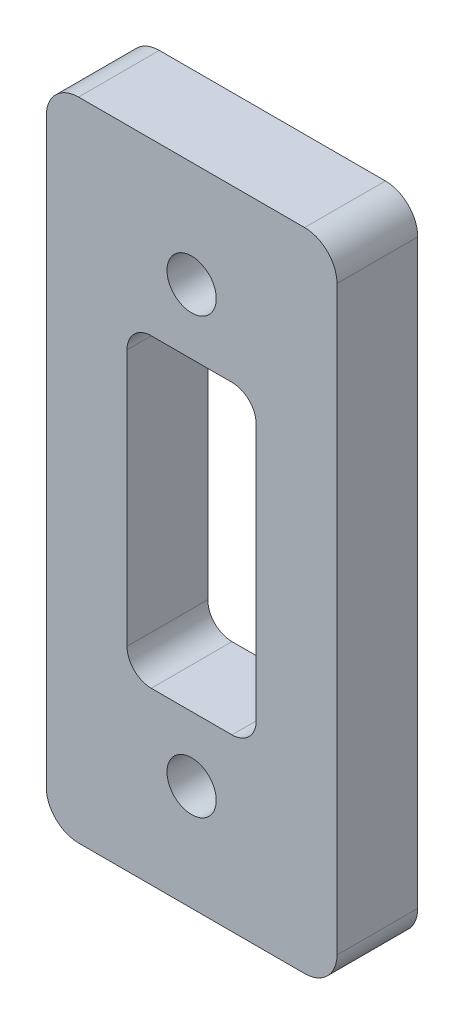
ISO-10303-21;
HEADER;
FILE_DESCRIPTION(('STEP AP214'),'2;1');
FILE_NAME('part.step','',(''),(''),'','','');
FILE_SCHEMA(('AUTOMOTIVE_DESIGN { 1 0 10303 214 1 1 1 1 }'));
ENDSEC;
DATA;
#1=APPLICATION_CONTEXT('core data for automotive mechanical design processes');
#2=APPLICATION_PROTOCOL_DEFINITION('international standard','automotive_design',2000,#1);
#3=PRODUCT_CONTEXT('',#1,'mechanical');
#4=PRODUCT('Part','Part','',(#3));
#5=PRODUCT_RELATED_PRODUCT_CATEGORY('part','',(#4));
#6=PRODUCT_DEFINITION_FORMATION('','',#4);
#7=PRODUCT_DEFINITION_CONTEXT('part definition',#1,'design');
#8=PRODUCT_DEFINITION('design','',#6,#7);
#9=PRODUCT_DEFINITION_SHAPE('','',#8);
#10=(LENGTH_UNIT() NAMED_UNIT(*) SI_UNIT(.MILLI.,.METRE.));
#11=(NAMED_UNIT(*) PLANE_ANGLE_UNIT() SI_UNIT($,.RADIAN.));
#12=(NAMED_UNIT(*) SI_UNIT($,.STERADIAN.) SOLID_ANGLE_UNIT());
#13=UNCERTAINTY_MEASURE_WITH_UNIT(LENGTH_MEASURE(1.E-05),#10,'distance_accuracy_value','');
#14=(GEOMETRIC_REPRESENTATION_CONTEXT(3) GLOBAL_UNCERTAINTY_ASSIGNED_CONTEXT((#13)) GLOBAL_UNIT_ASSIGNED_CONTEXT((#10,
#11,#12)) REPRESENTATION_CONTEXT('',''));
#15=CARTESIAN_POINT('',(0.,0.,0.));
#16=DIRECTION('',(0.,0.,1.));
#17=DIRECTION('',(1.,0.,0.));
#18=AXIS2_PLACEMENT_3D('',#15,#16,#17);
#19=CARTESIAN_POINT('',(0.,0.,5.));
#20=DIRECTION('',(0.,0.,-1.));
#21=DIRECTION('',(-1.,0.,0.));
#22=AXIS2_PLACEMENT_3D('',#19,#20,#21);
#23=PLANE('',#22);
#24=DIRECTION('',(-1.,0.,0.));
#25=VECTOR('',#24,1.);
#26=CARTESIAN_POINT('',(-4.,9.44999999999999,5.));
#27=LINE('',#26,#25);
#28=CARTESIAN_POINT('',(2.5,9.44999999999999,5.));
#29=VERTEX_POINT('',#28);
#30=CARTESIAN_POINT('',(-2.5,9.44999999999999,5.));
#31=VERTEX_POINT('',#30);
#32=EDGE_CURVE('E263',#29,#31,#27,.T.);
#33=ORIENTED_EDGE('',*,*,#32,.F.);
#34=CARTESIAN_POINT('',(2.5,7.94999999999999,5.));
#35=DIRECTION('',(0.,0.,-1.));
#36=DIRECTION('',(-1.,0.,0.));
#37=AXIS2_PLACEMENT_3D('',#34,#35,#36);
#38=CIRCLE('',#37,1.5);
#39=CARTESIAN_POINT('',(4.,7.94999999999999,5.));
#40=VERTEX_POINT('',#39);
#41=EDGE_CURVE('E241',#29,#40,#38,.T.);
#42=ORIENTED_EDGE('',*,*,#41,.T.);
#43=DIRECTION('',(0.,1.,0.));
#44=VECTOR('',#43,1.);
#45=CARTESIAN_POINT('',(4.,-9.45,5.));
#46=LINE('',#45,#44);
#47=CARTESIAN_POINT('',(4.,-7.94999999999999,5.));
#48=VERTEX_POINT('',#47);
#49=EDGE_CURVE('E278',#48,#40,#46,.T.);
#50=ORIENTED_EDGE('',*,*,#49,.F.);
#51=CARTESIAN_POINT('',(2.5,-7.94999999999999,5.));
#52=DIRECTION('',(0.,0.,-1.));
#53=DIRECTION('',(-1.,0.,0.));
#54=AXIS2_PLACEMENT_3D('',#51,#52,#53);
#55=CIRCLE('',#54,1.5);
#56=CARTESIAN_POINT('',(2.5,-9.45,5.));
#57=VERTEX_POINT('',#56);
#58=EDGE_CURVE('E245',#48,#57,#55,.T.);
#59=ORIENTED_EDGE('',*,*,#58,.T.);
#60=DIRECTION('',(1.,0.,0.));
#61=VECTOR('',#60,1.);
#62=CARTESIAN_POINT('',(-4.,-9.45,5.));
#63=LINE('',#62,#61);
#64=CARTESIAN_POINT('',(-2.5,-9.45,5.));
#65=VERTEX_POINT('',#64);
#66=EDGE_CURVE('E255',#65,#57,#63,.T.);
#67=ORIENTED_EDGE('',*,*,#66,.F.);
#68=CARTESIAN_POINT('',(-2.5,-7.94999999999999,5.));
#69=DIRECTION('',(0.,0.,-1.));
#70=DIRECTION('',(-1.,0.,0.));
#71=AXIS2_PLACEMENT_3D('',#68,#69,#70);
#72=CIRCLE('',#71,1.5);
#73=CARTESIAN_POINT('',(-4.,-7.94999999999999,5.));
#74=VERTEX_POINT('',#73);
#75=EDGE_CURVE('E43',#65,#74,#72,.T.);
#76=ORIENTED_EDGE('',*,*,#75,.T.);
#77=DIRECTION('',(0.,-1.,0.));
#78=VECTOR('',#77,1.);
#79=CARTESIAN_POINT('',(-4.,-9.45,5.));
#80=LINE('',#79,#78);
#81=CARTESIAN_POINT('',(-4.,7.94999999999999,5.));
#82=VERTEX_POINT('',#81);
#83=EDGE_CURVE('E254',#82,#74,#80,.T.);
#84=ORIENTED_EDGE('',*,*,#83,.F.);
#85=CARTESIAN_POINT('',(-2.5,7.94999999999999,5.));
#86=DIRECTION('',(0.,0.,-1.));
#87=DIRECTION('',(-1.,0.,0.));
#88=AXIS2_PLACEMENT_3D('',#85,#86,#87);
#89=CIRCLE('',#88,1.5);
#90=EDGE_CURVE('E237',#82,#31,#89,.T.);
#91=ORIENTED_EDGE('',*,*,#90,.T.);
#92=EDGE_LOOP('',(#33,#42,#50,#59,#67,#76,#84,#91));
#93=FACE_BOUND('',#92,.T.);
#94=DIRECTION('',(1.,0.,0.));
#95=VECTOR('',#94,1.);
#96=CARTESIAN_POINT('',(-9.,-20.,5.));
#97=LINE('',#96,#95);
#98=CARTESIAN_POINT('',(-7.,-20.,5.));
#99=VERTEX_POINT('',#98);
#100=CARTESIAN_POINT('',(7.,-20.,5.));
#101=VERTEX_POINT('',#100);
#102=EDGE_CURVE('E185',#99,#101,#97,.T.);
#103=ORIENTED_EDGE('',*,*,#102,.T.);
#104=CARTESIAN_POINT('',(7.,-18.,5.));
#105=DIRECTION('',(0.,0.,-1.));
#106=DIRECTION('',(-1.,0.,0.));
#107=AXIS2_PLACEMENT_3D('',#104,#105,#106);
#108=CIRCLE('',#107,2.);
#109=CARTESIAN_POINT('',(9.,-18.,5.));
#110=VERTEX_POINT('',#109);
#111=EDGE_CURVE('E206',#101,#110,#108,.F.);
#112=ORIENTED_EDGE('',*,*,#111,.T.);
#113=DIRECTION('',(0.,1.,0.));
#114=VECTOR('',#113,1.);
#115=CARTESIAN_POINT('',(9.,-20.,5.));
#116=LINE('',#115,#114);
#117=CARTESIAN_POINT('',(9.,18.,5.));
#118=VERTEX_POINT('',#117);
#119=EDGE_CURVE('E168',#110,#118,#116,.T.);
#120=ORIENTED_EDGE('',*,*,#119,.T.);
#121=CARTESIAN_POINT('',(7.,18.,5.));
#122=DIRECTION('',(0.,0.,-1.));
#123=DIRECTION('',(-1.,0.,0.));
#124=AXIS2_PLACEMENT_3D('',#121,#122,#123);
#125=CIRCLE('',#124,2.);
#126=CARTESIAN_POINT('',(7.,20.,5.));
#127=VERTEX_POINT('',#126);
#128=EDGE_CURVE('E200',#118,#127,#125,.F.);
#129=ORIENTED_EDGE('',*,*,#128,.T.);
#130=DIRECTION('',(-1.,0.,0.));
#131=VECTOR('',#130,1.);
#132=CARTESIAN_POINT('',(-9.,20.,5.));
#133=LINE('',#132,#131);
#134=CARTESIAN_POINT('',(-7.,20.,5.));
#135=VERTEX_POINT('',#134);
#136=EDGE_CURVE('E290',#127,#135,#133,.T.);
#137=ORIENTED_EDGE('',*,*,#136,.T.);
#138=CARTESIAN_POINT('',(-7.,18.,5.));
#139=DIRECTION('',(0.,0.,-1.));
#140=DIRECTION('',(-1.,0.,0.));
#141=AXIS2_PLACEMENT_3D('',#138,#139,#140);
#142=CIRCLE('',#141,2.);
#143=CARTESIAN_POINT('',(-9.,18.,5.));
#144=VERTEX_POINT('',#143);
#145=EDGE_CURVE('E202',#135,#144,#142,.F.);
#146=ORIENTED_EDGE('',*,*,#145,.T.);
#147=DIRECTION('',(0.,-1.,0.));
#148=VECTOR('',#147,1.);
#149=CARTESIAN_POINT('',(-9.,-20.,5.));
#150=LINE('',#149,#148);
#151=CARTESIAN_POINT('',(-9.,-18.,5.));
#152=VERTEX_POINT('',#151);
#153=EDGE_CURVE('E292',#144,#152,#150,.T.);
#154=ORIENTED_EDGE('',*,*,#153,.T.);
#155=CARTESIAN_POINT('',(-7.,-18.,5.));
#156=DIRECTION('',(0.,0.,-1.));
#157=DIRECTION('',(-1.,0.,0.));
#158=AXIS2_PLACEMENT_3D('',#155,#156,#157);
#159=CIRCLE('',#158,2.);
#160=EDGE_CURVE('E204',#152,#99,#159,.F.);
#161=ORIENTED_EDGE('',*,*,#160,.T.);
#162=EDGE_LOOP('',(#103,#112,#120,#129,#137,#146,#154,#161));
#163=FACE_BOUND('',#162,.T.);
#164=CARTESIAN_POINT('',(0.,13.45,5.));
#165=DIRECTION('',(0.,0.,1.));
#166=DIRECTION('',(1.,0.,0.));
#167=AXIS2_PLACEMENT_3D('',#164,#165,#166);
#168=CIRCLE('',#167,1.525);
#169=CARTESIAN_POINT('',(1.525,13.45,5.));
#170=VERTEX_POINT('',#169);
#171=EDGE_CURVE('E176',#170,#170,#168,.T.);
#172=ORIENTED_EDGE('',*,*,#171,.F.);
#173=EDGE_LOOP('',(#172));
#174=FACE_BOUND('',#173,.T.);
#175=CARTESIAN_POINT('',(0.,-13.45,5.));
#176=DIRECTION('',(0.,0.,1.));
#177=DIRECTION('',(1.,0.,0.));
#178=AXIS2_PLACEMENT_3D('',#175,#176,#177);
#179=CIRCLE('',#178,1.525);
#180=CARTESIAN_POINT('',(1.525,-13.45,5.));
#181=VERTEX_POINT('',#180);
#182=EDGE_CURVE('E272',#181,#181,#179,.T.);
#183=ORIENTED_EDGE('',*,*,#182,.F.);
#184=EDGE_LOOP('',(#183));
#185=FACE_BOUND('',#184,.T.);
#186=ADVANCED_FACE('F35',(#93,#163,#174,#185),#23,.F.);
#187=CARTESIAN_POINT('',(0.,0.,0.));
#188=DIRECTION('',(0.,0.,-1.));
#189=DIRECTION('',(-1.,0.,0.));
#190=AXIS2_PLACEMENT_3D('',#187,#188,#189);
#191=PLANE('',#190);
#192=DIRECTION('',(1.,0.,0.));
#193=VECTOR('',#192,1.);
#194=CARTESIAN_POINT('',(-4.,-9.45,0.));
#195=LINE('',#194,#193);
#196=CARTESIAN_POINT('',(-2.5,-9.45,0.));
#197=VERTEX_POINT('',#196);
#198=CARTESIAN_POINT('',(2.5,-9.45,0.));
#199=VERTEX_POINT('',#198);
#200=EDGE_CURVE('E266',#197,#199,#195,.T.);
#201=ORIENTED_EDGE('',*,*,#200,.T.);
#202=CARTESIAN_POINT('',(2.5,-7.94999999999999,0.));
#203=DIRECTION('',(0.,0.,-1.));
#204=DIRECTION('',(-1.,0.,0.));
#205=AXIS2_PLACEMENT_3D('',#202,#203,#204);
#206=CIRCLE('',#205,1.5);
#207=CARTESIAN_POINT('',(4.,-7.94999999999999,0.));
#208=VERTEX_POINT('',#207);
#209=EDGE_CURVE('E247',#199,#208,#206,.F.);
#210=ORIENTED_EDGE('',*,*,#209,.T.);
#211=DIRECTION('',(0.,1.,0.));
#212=VECTOR('',#211,1.);
#213=CARTESIAN_POINT('',(4.,-9.45,0.));
#214=LINE('',#213,#212);
#215=CARTESIAN_POINT('',(4.,7.94999999999999,0.));
#216=VERTEX_POINT('',#215);
#217=EDGE_CURVE('E284',#208,#216,#214,.T.);
#218=ORIENTED_EDGE('',*,*,#217,.T.);
#219=CARTESIAN_POINT('',(2.5,7.94999999999999,0.));
#220=DIRECTION('',(0.,0.,-1.));
#221=DIRECTION('',(-1.,0.,0.));
#222=AXIS2_PLACEMENT_3D('',#219,#220,#221);
#223=CIRCLE('',#222,1.5);
#224=CARTESIAN_POINT('',(2.5,9.44999999999999,0.));
#225=VERTEX_POINT('',#224);
#226=EDGE_CURVE('E243',#216,#225,#223,.F.);
#227=ORIENTED_EDGE('',*,*,#226,.T.);
#228=DIRECTION('',(-1.,0.,0.));
#229=VECTOR('',#228,1.);
#230=CARTESIAN_POINT('',(-4.,9.44999999999999,0.));
#231=LINE('',#230,#229);
#232=CARTESIAN_POINT('',(-2.5,9.44999999999999,0.));
#233=VERTEX_POINT('',#232);
#234=EDGE_CURVE('E274',#225,#233,#231,.T.);
#235=ORIENTED_EDGE('',*,*,#234,.T.);
#236=CARTESIAN_POINT('',(-2.5,7.94999999999999,0.));
#237=DIRECTION('',(0.,0.,-1.));
#238=DIRECTION('',(-1.,0.,0.));
#239=AXIS2_PLACEMENT_3D('',#236,#237,#238);
#240=CIRCLE('',#239,1.5);
#241=CARTESIAN_POINT('',(-4.,7.94999999999999,0.));
#242=VERTEX_POINT('',#241);
#243=EDGE_CURVE('E239',#233,#242,#240,.F.);
#244=ORIENTED_EDGE('',*,*,#243,.T.);
#245=DIRECTION('',(0.,-1.,0.));
#246=VECTOR('',#245,1.);
#247=CARTESIAN_POINT('',(-4.,-9.45,0.));
#248=LINE('',#247,#246);
#249=CARTESIAN_POINT('',(-4.,-7.94999999999999,0.));
#250=VERTEX_POINT('',#249);
#251=EDGE_CURVE('E269',#242,#250,#248,.T.);
#252=ORIENTED_EDGE('',*,*,#251,.T.);
#253=CARTESIAN_POINT('',(-2.5,-7.94999999999999,0.));
#254=DIRECTION('',(0.,0.,-1.));
#255=DIRECTION('',(-1.,0.,0.));
#256=AXIS2_PLACEMENT_3D('',#253,#254,#255);
#257=CIRCLE('',#256,1.5);
#258=EDGE_CURVE('E11',#250,#197,#257,.F.);
#259=ORIENTED_EDGE('',*,*,#258,.T.);
#260=EDGE_LOOP('',(#201,#210,#218,#227,#235,#244,#252,#259));
#261=FACE_BOUND('',#260,.T.);
#262=CARTESIAN_POINT('',(0.,13.45,0.));
#263=DIRECTION('',(0.,0.,1.));
#264=DIRECTION('',(1.,0.,0.));
#265=AXIS2_PLACEMENT_3D('',#262,#263,#264);
#266=CIRCLE('',#265,1.525);
#267=CARTESIAN_POINT('',(1.525,13.45,0.));
#268=VERTEX_POINT('',#267);
#269=EDGE_CURVE('E182',#268,#268,#266,.T.);
#270=ORIENTED_EDGE('',*,*,#269,.T.);
#271=EDGE_LOOP('',(#270));
#272=FACE_BOUND('',#271,.T.);
#273=DIRECTION('',(0.,1.,0.));
#274=VECTOR('',#273,1.);
#275=CARTESIAN_POINT('',(9.,-20.,0.));
#276=LINE('',#275,#274);
#277=CARTESIAN_POINT('',(9.,-18.,0.));
#278=VERTEX_POINT('',#277);
#279=CARTESIAN_POINT('',(9.,18.,0.));
#280=VERTEX_POINT('',#279);
#281=EDGE_CURVE('E165',#278,#280,#276,.T.);
#282=ORIENTED_EDGE('',*,*,#281,.F.);
#283=CARTESIAN_POINT('',(7.,-18.,0.));
#284=DIRECTION('',(0.,0.,-1.));
#285=DIRECTION('',(-1.,0.,0.));
#286=AXIS2_PLACEMENT_3D('',#283,#284,#285);
#287=CIRCLE('',#286,2.);
#288=CARTESIAN_POINT('',(7.,-20.,0.));
#289=VERTEX_POINT('',#288);
#290=EDGE_CURVE('E148',#278,#289,#287,.T.);
#291=ORIENTED_EDGE('',*,*,#290,.T.);
#292=DIRECTION('',(1.,0.,0.));
#293=VECTOR('',#292,1.);
#294=CARTESIAN_POINT('',(-9.,-20.,0.));
#295=LINE('',#294,#293);
#296=CARTESIAN_POINT('',(-7.,-20.,0.));
#297=VERTEX_POINT('',#296);
#298=EDGE_CURVE('E190',#297,#289,#295,.T.);
#299=ORIENTED_EDGE('',*,*,#298,.F.);
#300=CARTESIAN_POINT('',(-7.,-18.,0.));
#301=DIRECTION('',(0.,0.,-1.));
#302=DIRECTION('',(-1.,0.,0.));
#303=AXIS2_PLACEMENT_3D('',#300,#301,#302);
#304=CIRCLE('',#303,2.);
#305=CARTESIAN_POINT('',(-9.,-18.,0.));
#306=VERTEX_POINT('',#305);
#307=EDGE_CURVE('E159',#297,#306,#304,.T.);
#308=ORIENTED_EDGE('',*,*,#307,.T.);
#309=DIRECTION('',(0.,-1.,0.));
#310=VECTOR('',#309,1.);
#311=CARTESIAN_POINT('',(-9.,-20.,0.));
#312=LINE('',#311,#310);
#313=CARTESIAN_POINT('',(-9.,18.,0.));
#314=VERTEX_POINT('',#313);
#315=EDGE_CURVE('E179',#314,#306,#312,.T.);
#316=ORIENTED_EDGE('',*,*,#315,.F.);
#317=CARTESIAN_POINT('',(-7.,18.,0.));
#318=DIRECTION('',(0.,0.,-1.));
#319=DIRECTION('',(-1.,0.,0.));
#320=AXIS2_PLACEMENT_3D('',#317,#318,#319);
#321=CIRCLE('',#320,2.);
#322=CARTESIAN_POINT('',(-7.,20.,0.));
#323=VERTEX_POINT('',#322);
#324=EDGE_CURVE('E194',#314,#323,#321,.T.);
#325=ORIENTED_EDGE('',*,*,#324,.T.);
#326=DIRECTION('',(-1.,0.,0.));
#327=VECTOR('',#326,1.);
#328=CARTESIAN_POINT('',(-9.,20.,0.));
#329=LINE('',#328,#327);
#330=CARTESIAN_POINT('',(7.,20.,0.));
#331=VERTEX_POINT('',#330);
#332=EDGE_CURVE('E175',#331,#323,#329,.T.);
#333=ORIENTED_EDGE('',*,*,#332,.F.);
#334=CARTESIAN_POINT('',(7.,18.,0.));
#335=DIRECTION('',(0.,0.,-1.));
#336=DIRECTION('',(-1.,0.,0.));
#337=AXIS2_PLACEMENT_3D('',#334,#335,#336);
#338=CIRCLE('',#337,2.);
#339=EDGE_CURVE('E169',#331,#280,#338,.T.);
#340=ORIENTED_EDGE('',*,*,#339,.T.);
#341=EDGE_LOOP('',(#282,#291,#299,#308,#316,#325,#333,#340));
#342=FACE_BOUND('',#341,.T.);
#343=CARTESIAN_POINT('',(0.,-13.45,0.));
#344=DIRECTION('',(0.,0.,1.));
#345=DIRECTION('',(1.,0.,0.));
#346=AXIS2_PLACEMENT_3D('',#343,#344,#345);
#347=CIRCLE('',#346,1.525);
#348=CARTESIAN_POINT('',(1.525,-13.45,0.));
#349=VERTEX_POINT('',#348);
#350=EDGE_CURVE('E268',#349,#349,#347,.T.);
#351=ORIENTED_EDGE('',*,*,#350,.T.);
#352=EDGE_LOOP('',(#351));
#353=FACE_BOUND('',#352,.T.);
#354=ADVANCED_FACE('F172',(#261,#272,#342,#353),#191,.T.);
#355=CARTESIAN_POINT('',(9.,-20.,5.));
#356=DIRECTION('',(-1.,0.,0.));
#357=DIRECTION('',(0.,0.,1.));
#358=AXIS2_PLACEMENT_3D('',#355,#356,#357);
#359=PLANE('',#358);
#360=ORIENTED_EDGE('',*,*,#119,.F.);
#361=DIRECTION('',(0.,0.,-1.));
#362=VECTOR('',#361,1.);
#363=CARTESIAN_POINT('',(9.,-18.,5.));
#364=LINE('',#363,#362);
#365=EDGE_CURVE('E152',#110,#278,#364,.T.);
#366=ORIENTED_EDGE('',*,*,#365,.T.);
#367=ORIENTED_EDGE('',*,*,#281,.T.);
#368=DIRECTION('',(0.,0.,-1.));
#369=VECTOR('',#368,1.);
#370=CARTESIAN_POINT('',(9.,18.,5.));
#371=LINE('',#370,#369);
#372=EDGE_CURVE('E170',#280,#118,#371,.F.);
#373=ORIENTED_EDGE('',*,*,#372,.T.);
#374=EDGE_LOOP('',(#360,#366,#367,#373));
#375=FACE_BOUND('',#374,.T.);
#376=ADVANCED_FACE('F164',(#375),#359,.F.);
#377=CARTESIAN_POINT('',(-9.,20.,5.));
#378=DIRECTION('',(0.,-1.,0.));
#379=DIRECTION('',(0.,0.,-1.));
#380=AXIS2_PLACEMENT_3D('',#377,#378,#379);
#381=PLANE('',#380);
#382=ORIENTED_EDGE('',*,*,#332,.T.);
#383=DIRECTION('',(0.,0.,-1.));
#384=VECTOR('',#383,1.);
#385=CARTESIAN_POINT('',(-7.,20.,5.));
#386=LINE('',#385,#384);
#387=EDGE_CURVE('E216',#323,#135,#386,.F.);
#388=ORIENTED_EDGE('',*,*,#387,.T.);
#389=ORIENTED_EDGE('',*,*,#136,.F.);
#390=DIRECTION('',(0.,0.,-1.));
#391=VECTOR('',#390,1.);
#392=CARTESIAN_POINT('',(7.,20.,5.));
#393=LINE('',#392,#391);
#394=EDGE_CURVE('E213',#127,#331,#393,.T.);
#395=ORIENTED_EDGE('',*,*,#394,.T.);
#396=EDGE_LOOP('',(#382,#388,#389,#395));
#397=FACE_BOUND('',#396,.T.);
#398=ADVANCED_FACE('F314',(#397),#381,.F.);
#399=CARTESIAN_POINT('',(-9.,-20.,5.));
#400=DIRECTION('',(1.,0.,0.));
#401=DIRECTION('',(0.,0.,-1.));
#402=AXIS2_PLACEMENT_3D('',#399,#400,#401);
#403=PLANE('',#402);
#404=ORIENTED_EDGE('',*,*,#315,.T.);
#405=DIRECTION('',(0.,0.,-1.));
#406=VECTOR('',#405,1.);
#407=CARTESIAN_POINT('',(-9.,-18.,5.));
#408=LINE('',#407,#406);
#409=EDGE_CURVE('E211',#306,#152,#408,.F.);
#410=ORIENTED_EDGE('',*,*,#409,.T.);
#411=ORIENTED_EDGE('',*,*,#153,.F.);
#412=DIRECTION('',(0.,0.,-1.));
#413=VECTOR('',#412,1.);
#414=CARTESIAN_POINT('',(-9.,18.,5.));
#415=LINE('',#414,#413);
#416=EDGE_CURVE('E208',#144,#314,#415,.T.);
#417=ORIENTED_EDGE('',*,*,#416,.T.);
#418=EDGE_LOOP('',(#404,#410,#411,#417));
#419=FACE_BOUND('',#418,.T.);
#420=ADVANCED_FACE('F307',(#419),#403,.F.);
#421=CARTESIAN_POINT('',(-9.,-20.,5.));
#422=DIRECTION('',(0.,1.,0.));
#423=DIRECTION('',(0.,0.,1.));
#424=AXIS2_PLACEMENT_3D('',#421,#422,#423);
#425=PLANE('',#424);
#426=ORIENTED_EDGE('',*,*,#298,.T.);
#427=DIRECTION('',(0.,0.,-1.));
#428=VECTOR('',#427,1.);
#429=CARTESIAN_POINT('',(7.,-20.,5.));
#430=LINE('',#429,#428);
#431=EDGE_CURVE('E153',#289,#101,#430,.F.);
#432=ORIENTED_EDGE('',*,*,#431,.T.);
#433=ORIENTED_EDGE('',*,*,#102,.F.);
#434=DIRECTION('',(0.,0.,-1.));
#435=VECTOR('',#434,1.);
#436=CARTESIAN_POINT('',(-7.,-20.,5.));
#437=LINE('',#436,#435);
#438=EDGE_CURVE('E158',#99,#297,#437,.T.);
#439=ORIENTED_EDGE('',*,*,#438,.T.);
#440=EDGE_LOOP('',(#426,#432,#433,#439));
#441=FACE_BOUND('',#440,.T.);
#442=ADVANCED_FACE('F301',(#441),#425,.F.);
#443=CARTESIAN_POINT('',(0.,13.45,5.));
#444=DIRECTION('',(0.,0.,-1.));
#445=DIRECTION('',(-1.,0.,0.));
#446=AXIS2_PLACEMENT_3D('',#443,#444,#445);
#447=CYLINDRICAL_SURFACE('',#446,1.525);
#448=ORIENTED_EDGE('',*,*,#171,.T.);
#449=EDGE_LOOP('',(#448));
#450=FACE_BOUND('',#449,.T.);
#451=ORIENTED_EDGE('',*,*,#269,.F.);
#452=EDGE_LOOP('',(#451));
#453=FACE_BOUND('',#452,.T.);
#454=ADVANCED_FACE('F338',(#450,#453),#447,.F.);
#455=CARTESIAN_POINT('',(0.,-13.45,5.));
#456=DIRECTION('',(0.,0.,-1.));
#457=DIRECTION('',(-1.,0.,0.));
#458=AXIS2_PLACEMENT_3D('',#455,#456,#457);
#459=CYLINDRICAL_SURFACE('',#458,1.525);
#460=ORIENTED_EDGE('',*,*,#182,.T.);
#461=EDGE_LOOP('',(#460));
#462=FACE_BOUND('',#461,.T.);
#463=ORIENTED_EDGE('',*,*,#350,.F.);
#464=EDGE_LOOP('',(#463));
#465=FACE_BOUND('',#464,.T.);
#466=ADVANCED_FACE('F351',(#462,#465),#459,.F.);
#467=CARTESIAN_POINT('',(7.,-18.,5.));
#468=DIRECTION('',(0.,0.,-1.));
#469=DIRECTION('',(-1.,0.,0.));
#470=AXIS2_PLACEMENT_3D('',#467,#468,#469);
#471=CYLINDRICAL_SURFACE('',#470,2.);
#472=ORIENTED_EDGE('',*,*,#111,.F.);
#473=ORIENTED_EDGE('',*,*,#431,.F.);
#474=ORIENTED_EDGE('',*,*,#290,.F.);
#475=ORIENTED_EDGE('',*,*,#365,.F.);
#476=EDGE_LOOP('',(#472,#473,#474,#475));
#477=FACE_BOUND('',#476,.T.);
#478=ADVANCED_FACE('F151',(#477),#471,.T.);
#479=CARTESIAN_POINT('',(-7.,-18.,5.));
#480=DIRECTION('',(0.,0.,-1.));
#481=DIRECTION('',(-1.,0.,0.));
#482=AXIS2_PLACEMENT_3D('',#479,#480,#481);
#483=CYLINDRICAL_SURFACE('',#482,2.);
#484=ORIENTED_EDGE('',*,*,#160,.F.);
#485=ORIENTED_EDGE('',*,*,#409,.F.);
#486=ORIENTED_EDGE('',*,*,#307,.F.);
#487=ORIENTED_EDGE('',*,*,#438,.F.);
#488=EDGE_LOOP('',(#484,#485,#486,#487));
#489=FACE_BOUND('',#488,.T.);
#490=ADVANCED_FACE('F303',(#489),#483,.T.);
#491=CARTESIAN_POINT('',(-7.,18.,5.));
#492=DIRECTION('',(0.,0.,-1.));
#493=DIRECTION('',(-1.,0.,0.));
#494=AXIS2_PLACEMENT_3D('',#491,#492,#493);
#495=CYLINDRICAL_SURFACE('',#494,2.);
#496=ORIENTED_EDGE('',*,*,#145,.F.);
#497=ORIENTED_EDGE('',*,*,#387,.F.);
#498=ORIENTED_EDGE('',*,*,#324,.F.);
#499=ORIENTED_EDGE('',*,*,#416,.F.);
#500=EDGE_LOOP('',(#496,#497,#498,#499));
#501=FACE_BOUND('',#500,.T.);
#502=ADVANCED_FACE('F311',(#501),#495,.T.);
#503=CARTESIAN_POINT('',(7.,18.,5.));
#504=DIRECTION('',(0.,0.,-1.));
#505=DIRECTION('',(-1.,0.,0.));
#506=AXIS2_PLACEMENT_3D('',#503,#504,#505);
#507=CYLINDRICAL_SURFACE('',#506,2.);
#508=ORIENTED_EDGE('',*,*,#128,.F.);
#509=ORIENTED_EDGE('',*,*,#372,.F.);
#510=ORIENTED_EDGE('',*,*,#339,.F.);
#511=ORIENTED_EDGE('',*,*,#394,.F.);
#512=EDGE_LOOP('',(#508,#509,#510,#511));
#513=FACE_BOUND('',#512,.T.);
#514=ADVANCED_FACE('F319',(#513),#507,.T.);
#515=CARTESIAN_POINT('',(4.,-9.45,0.));
#516=DIRECTION('',(1.,0.,0.));
#517=DIRECTION('',(0.,0.,-1.));
#518=AXIS2_PLACEMENT_3D('',#515,#516,#517);
#519=PLANE('',#518);
#520=ORIENTED_EDGE('',*,*,#49,.T.);
#521=DIRECTION('',(0.,0.,1.));
#522=VECTOR('',#521,1.);
#523=CARTESIAN_POINT('',(4.,7.94999999999999,0.));
#524=LINE('',#523,#522);
#525=EDGE_CURVE('E231',#40,#216,#524,.F.);
#526=ORIENTED_EDGE('',*,*,#525,.T.);
#527=ORIENTED_EDGE('',*,*,#217,.F.);
#528=DIRECTION('',(0.,0.,1.));
#529=VECTOR('',#528,1.);
#530=CARTESIAN_POINT('',(4.,-7.94999999999999,5.));
#531=LINE('',#530,#529);
#532=EDGE_CURVE('E228',#208,#48,#531,.T.);
#533=ORIENTED_EDGE('',*,*,#532,.T.);
#534=EDGE_LOOP('',(#520,#526,#527,#533));
#535=FACE_BOUND('',#534,.T.);
#536=ADVANCED_FACE('F321',(#535),#519,.F.);
#537=CARTESIAN_POINT('',(-4.,-9.45,0.));
#538=DIRECTION('',(0.,-1.,0.));
#539=DIRECTION('',(0.,0.,-1.));
#540=AXIS2_PLACEMENT_3D('',#537,#538,#539);
#541=PLANE('',#540);
#542=ORIENTED_EDGE('',*,*,#66,.T.);
#543=DIRECTION('',(0.,0.,1.));
#544=VECTOR('',#543,1.);
#545=CARTESIAN_POINT('',(2.5,-9.45,0.));
#546=LINE('',#545,#544);
#547=EDGE_CURVE('E50',#57,#199,#546,.F.);
#548=ORIENTED_EDGE('',*,*,#547,.T.);
#549=ORIENTED_EDGE('',*,*,#200,.F.);
#550=DIRECTION('',(0.,0.,1.));
#551=VECTOR('',#550,1.);
#552=CARTESIAN_POINT('',(-2.5,-9.45,5.));
#553=LINE('',#552,#551);
#554=EDGE_CURVE('E233',#197,#65,#553,.T.);
#555=ORIENTED_EDGE('',*,*,#554,.T.);
#556=EDGE_LOOP('',(#542,#548,#549,#555));
#557=FACE_BOUND('',#556,.T.);
#558=ADVANCED_FACE('F265',(#557),#541,.F.);
#559=CARTESIAN_POINT('',(-4.,-9.45,0.));
#560=DIRECTION('',(-1.,0.,0.));
#561=DIRECTION('',(0.,0.,1.));
#562=AXIS2_PLACEMENT_3D('',#559,#560,#561);
#563=PLANE('',#562);
#564=ORIENTED_EDGE('',*,*,#251,.F.);
#565=DIRECTION('',(0.,0.,1.));
#566=VECTOR('',#565,1.);
#567=CARTESIAN_POINT('',(-4.,7.94999999999999,5.));
#568=LINE('',#567,#566);
#569=EDGE_CURVE('E220',#242,#82,#568,.T.);
#570=ORIENTED_EDGE('',*,*,#569,.T.);
#571=ORIENTED_EDGE('',*,*,#83,.T.);
#572=DIRECTION('',(0.,0.,1.));
#573=VECTOR('',#572,1.);
#574=CARTESIAN_POINT('',(-4.,-7.94999999999999,0.));
#575=LINE('',#574,#573);
#576=EDGE_CURVE('E218',#74,#250,#575,.F.);
#577=ORIENTED_EDGE('',*,*,#576,.T.);
#578=EDGE_LOOP('',(#564,#570,#571,#577));
#579=FACE_BOUND('',#578,.T.);
#580=ADVANCED_FACE('F261',(#579),#563,.F.);
#581=CARTESIAN_POINT('',(-4.,9.44999999999999,0.));
#582=DIRECTION('',(0.,1.,0.));
#583=DIRECTION('',(0.,0.,1.));
#584=AXIS2_PLACEMENT_3D('',#581,#582,#583);
#585=PLANE('',#584);
#586=ORIENTED_EDGE('',*,*,#32,.T.);
#587=DIRECTION('',(0.,0.,1.));
#588=VECTOR('',#587,1.);
#589=CARTESIAN_POINT('',(-2.5,9.44999999999999,0.));
#590=LINE('',#589,#588);
#591=EDGE_CURVE('E226',#31,#233,#590,.F.);
#592=ORIENTED_EDGE('',*,*,#591,.T.);
#593=ORIENTED_EDGE('',*,*,#234,.F.);
#594=DIRECTION('',(0.,0.,1.));
#595=VECTOR('',#594,1.);
#596=CARTESIAN_POINT('',(2.5,9.44999999999999,5.));
#597=LINE('',#596,#595);
#598=EDGE_CURVE('E223',#225,#29,#597,.T.);
#599=ORIENTED_EDGE('',*,*,#598,.T.);
#600=EDGE_LOOP('',(#586,#592,#593,#599));
#601=FACE_BOUND('',#600,.T.);
#602=ADVANCED_FACE('F400',(#601),#585,.F.);
#603=CARTESIAN_POINT('',(-2.5,7.94999999999999,0.));
#604=DIRECTION('',(0.,0.,-1.));
#605=DIRECTION('',(-1.,0.,0.));
#606=AXIS2_PLACEMENT_3D('',#603,#604,#605);
#607=CYLINDRICAL_SURFACE('',#606,1.5);
#608=ORIENTED_EDGE('',*,*,#243,.F.);
#609=ORIENTED_EDGE('',*,*,#591,.F.);
#610=ORIENTED_EDGE('',*,*,#90,.F.);
#611=ORIENTED_EDGE('',*,*,#569,.F.);
#612=EDGE_LOOP('',(#608,#609,#610,#611));
#613=FACE_BOUND('',#612,.T.);
#614=ADVANCED_FACE('F409',(#613),#607,.F.);
#615=CARTESIAN_POINT('',(2.5,7.94999999999999,0.));
#616=DIRECTION('',(0.,0.,-1.));
#617=DIRECTION('',(-1.,0.,0.));
#618=AXIS2_PLACEMENT_3D('',#615,#616,#617);
#619=CYLINDRICAL_SURFACE('',#618,1.5);
#620=ORIENTED_EDGE('',*,*,#226,.F.);
#621=ORIENTED_EDGE('',*,*,#525,.F.);
#622=ORIENTED_EDGE('',*,*,#41,.F.);
#623=ORIENTED_EDGE('',*,*,#598,.F.);
#624=EDGE_LOOP('',(#620,#621,#622,#623));
#625=FACE_BOUND('',#624,.T.);
#626=ADVANCED_FACE('F419',(#625),#619,.F.);
#627=CARTESIAN_POINT('',(2.5,-7.94999999999999,0.));
#628=DIRECTION('',(0.,0.,-1.));
#629=DIRECTION('',(-1.,0.,0.));
#630=AXIS2_PLACEMENT_3D('',#627,#628,#629);
#631=CYLINDRICAL_SURFACE('',#630,1.5);
#632=ORIENTED_EDGE('',*,*,#209,.F.);
#633=ORIENTED_EDGE('',*,*,#547,.F.);
#634=ORIENTED_EDGE('',*,*,#58,.F.);
#635=ORIENTED_EDGE('',*,*,#532,.F.);
#636=EDGE_LOOP('',(#632,#633,#634,#635));
#637=FACE_BOUND('',#636,.T.);
#638=ADVANCED_FACE('F428',(#637),#631,.F.);
#639=CARTESIAN_POINT('',(-2.5,-7.94999999999999,0.));
#640=DIRECTION('',(0.,0.,-1.));
#641=DIRECTION('',(-1.,0.,0.));
#642=AXIS2_PLACEMENT_3D('',#639,#640,#641);
#643=CYLINDRICAL_SURFACE('',#642,1.5);
#644=ORIENTED_EDGE('',*,*,#258,.F.);
#645=ORIENTED_EDGE('',*,*,#576,.F.);
#646=ORIENTED_EDGE('',*,*,#75,.F.);
#647=ORIENTED_EDGE('',*,*,#554,.F.);
#648=EDGE_LOOP('',(#644,#645,#646,#647));
#649=FACE_BOUND('',#648,.T.);
#650=ADVANCED_FACE('F37',(#649),#643,.F.);
#651=CLOSED_SHELL('',(#186,#354,#376,#398,#420,#442,#454,#466,#478,#490,#502,#514,#536,#558,
#580,#602,#614,#626,#638,#650));
#652=MANIFOLD_SOLID_BREP('B2',#651);
#653=ADVANCED_BREP_SHAPE_REPRESENTATION('',(#18,#652),#14);
#654=SHAPE_DEFINITION_REPRESENTATION(#9,#653);
ENDSEC;
END-ISO-10303-21;
